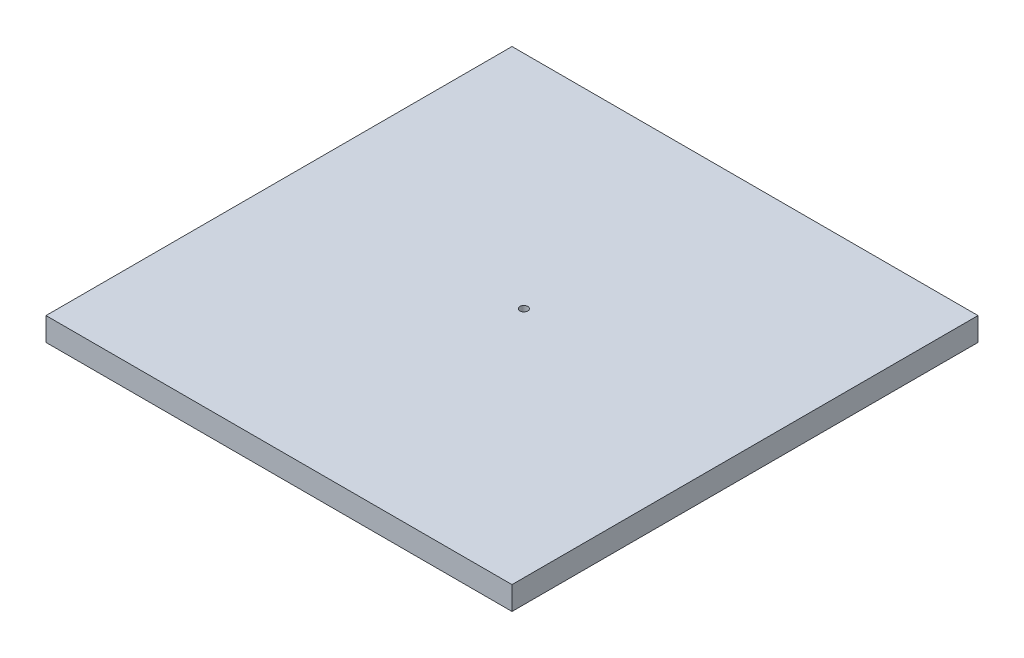
ISO-10303-21;
HEADER;
FILE_DESCRIPTION(('STEP AP214'),'2;1');
FILE_NAME('part.step','',(''),(''),'','','');
FILE_SCHEMA(('AUTOMOTIVE_DESIGN { 1 0 10303 214 1 1 1 1 }'));
ENDSEC;
DATA;
#1=APPLICATION_CONTEXT('core data for automotive mechanical design processes');
#2=APPLICATION_PROTOCOL_DEFINITION('international standard','automotive_design',2000,#1);
#3=PRODUCT_CONTEXT('',#1,'mechanical');
#4=PRODUCT('Part','Part','',(#3));
#5=PRODUCT_RELATED_PRODUCT_CATEGORY('part','',(#4));
#6=PRODUCT_DEFINITION_FORMATION('','',#4);
#7=PRODUCT_DEFINITION_CONTEXT('part definition',#1,'design');
#8=PRODUCT_DEFINITION('design','',#6,#7);
#9=PRODUCT_DEFINITION_SHAPE('','',#8);
#10=(LENGTH_UNIT() NAMED_UNIT(*) SI_UNIT(.MILLI.,.METRE.));
#11=(NAMED_UNIT(*) PLANE_ANGLE_UNIT() SI_UNIT($,.RADIAN.));
#12=(NAMED_UNIT(*) SI_UNIT($,.STERADIAN.) SOLID_ANGLE_UNIT());
#13=UNCERTAINTY_MEASURE_WITH_UNIT(LENGTH_MEASURE(1.E-05),#10,'distance_accuracy_value','');
#14=(GEOMETRIC_REPRESENTATION_CONTEXT(3) GLOBAL_UNCERTAINTY_ASSIGNED_CONTEXT((#13)) GLOBAL_UNIT_ASSIGNED_CONTEXT((#10,
#11,#12)) REPRESENTATION_CONTEXT('',''));
#15=CARTESIAN_POINT('',(0.,0.,0.));
#16=DIRECTION('',(0.,0.,1.));
#17=DIRECTION('',(1.,0.,0.));
#18=AXIS2_PLACEMENT_3D('',#15,#16,#17);
#19=CARTESIAN_POINT('',(-200.,20.,400.));
#20=DIRECTION('',(1.,0.,0.));
#21=DIRECTION('',(0.,0.,-1.));
#22=AXIS2_PLACEMENT_3D('',#19,#20,#21);
#23=PLANE('',#22);
#24=DIRECTION('',(0.,-1.,0.));
#25=VECTOR('',#24,1.);
#26=CARTESIAN_POINT('',(-200.,20.,0.));
#27=LINE('',#26,#25);
#28=CARTESIAN_POINT('',(-200.,20.,0.));
#29=VERTEX_POINT('',#28);
#30=CARTESIAN_POINT('',(-200.,0.,0.));
#31=VERTEX_POINT('',#30);
#32=EDGE_CURVE('E98',#29,#31,#27,.T.);
#33=ORIENTED_EDGE('',*,*,#32,.T.);
#34=DIRECTION('',(0.,0.,-1.));
#35=VECTOR('',#34,1.);
#36=CARTESIAN_POINT('',(-200.,0.,400.));
#37=LINE('',#36,#35);
#38=CARTESIAN_POINT('',(-200.,0.,400.));
#39=VERTEX_POINT('',#38);
#40=EDGE_CURVE('E11',#39,#31,#37,.T.);
#41=ORIENTED_EDGE('',*,*,#40,.F.);
#42=DIRECTION('',(0.,-1.,0.));
#43=VECTOR('',#42,1.);
#44=CARTESIAN_POINT('',(-200.,20.,400.));
#45=LINE('',#44,#43);
#46=CARTESIAN_POINT('',(-200.,20.,400.));
#47=VERTEX_POINT('',#46);
#48=EDGE_CURVE('E84',#47,#39,#45,.T.);
#49=ORIENTED_EDGE('',*,*,#48,.F.);
#50=DIRECTION('',(0.,0.,-1.));
#51=VECTOR('',#50,1.);
#52=CARTESIAN_POINT('',(-200.,20.,400.));
#53=LINE('',#52,#51);
#54=EDGE_CURVE('E51',#47,#29,#53,.T.);
#55=ORIENTED_EDGE('',*,*,#54,.T.);
#56=EDGE_LOOP('',(#33,#41,#49,#55));
#57=FACE_BOUND('',#56,.T.);
#58=ADVANCED_FACE('F35',(#57),#23,.F.);
#59=CARTESIAN_POINT('',(-200.,0.,400.));
#60=DIRECTION('',(0.,1.,0.));
#61=DIRECTION('',(0.,0.,1.));
#62=AXIS2_PLACEMENT_3D('',#59,#60,#61);
#63=PLANE('',#62);
#64=CARTESIAN_POINT('',(0.,0.,189.819719023603));
#65=DIRECTION('',(0.,-1.,0.));
#66=DIRECTION('',(0.,0.,-1.));
#67=AXIS2_PLACEMENT_3D('',#64,#65,#66);
#68=CIRCLE('',#67,3.39999999999999);
#69=CARTESIAN_POINT('',(0.,0.,186.419719023603));
#70=VERTEX_POINT('',#69);
#71=EDGE_CURVE('E112',#70,#70,#68,.T.);
#72=ORIENTED_EDGE('',*,*,#71,.F.);
#73=EDGE_LOOP('',(#72));
#74=FACE_BOUND('',#73,.T.);
#75=DIRECTION('',(1.,0.,0.));
#76=VECTOR('',#75,1.);
#77=CARTESIAN_POINT('',(-200.,0.,0.));
#78=LINE('',#77,#76);
#79=CARTESIAN_POINT('',(200.,0.,0.));
#80=VERTEX_POINT('',#79);
#81=EDGE_CURVE('E89',#31,#80,#78,.T.);
#82=ORIENTED_EDGE('',*,*,#81,.T.);
#83=DIRECTION('',(0.,0.,-1.));
#84=VECTOR('',#83,1.);
#85=CARTESIAN_POINT('',(200.,0.,400.));
#86=LINE('',#85,#84);
#87=CARTESIAN_POINT('',(200.,0.,400.));
#88=VERTEX_POINT('',#87);
#89=EDGE_CURVE('E43',#88,#80,#86,.T.);
#90=ORIENTED_EDGE('',*,*,#89,.F.);
#91=DIRECTION('',(1.,0.,0.));
#92=VECTOR('',#91,1.);
#93=CARTESIAN_POINT('',(-200.,0.,400.));
#94=LINE('',#93,#92);
#95=EDGE_CURVE('E76',#39,#88,#94,.T.);
#96=ORIENTED_EDGE('',*,*,#95,.F.);
#97=ORIENTED_EDGE('',*,*,#40,.T.);
#98=EDGE_LOOP('',(#82,#90,#96,#97));
#99=FACE_BOUND('',#98,.T.);
#100=ADVANCED_FACE('F88',(#74,#99),#63,.F.);
#101=CARTESIAN_POINT('',(200.,20.,400.));
#102=DIRECTION('',(1.,0.,0.));
#103=DIRECTION('',(0.,0.,-1.));
#104=AXIS2_PLACEMENT_3D('',#101,#102,#103);
#105=PLANE('',#104);
#106=DIRECTION('',(0.,-1.,0.));
#107=VECTOR('',#106,1.);
#108=CARTESIAN_POINT('',(200.,20.,0.));
#109=LINE('',#108,#107);
#110=CARTESIAN_POINT('',(200.,20.,0.));
#111=VERTEX_POINT('',#110);
#112=EDGE_CURVE('E102',#111,#80,#109,.T.);
#113=ORIENTED_EDGE('',*,*,#112,.F.);
#114=DIRECTION('',(0.,0.,-1.));
#115=VECTOR('',#114,1.);
#116=CARTESIAN_POINT('',(200.,20.,400.));
#117=LINE('',#116,#115);
#118=CARTESIAN_POINT('',(200.,20.,400.));
#119=VERTEX_POINT('',#118);
#120=EDGE_CURVE('E65',#119,#111,#117,.T.);
#121=ORIENTED_EDGE('',*,*,#120,.F.);
#122=DIRECTION('',(0.,-1.,0.));
#123=VECTOR('',#122,1.);
#124=CARTESIAN_POINT('',(200.,20.,400.));
#125=LINE('',#124,#123);
#126=EDGE_CURVE('E83',#119,#88,#125,.T.);
#127=ORIENTED_EDGE('',*,*,#126,.T.);
#128=ORIENTED_EDGE('',*,*,#89,.T.);
#129=EDGE_LOOP('',(#113,#121,#127,#128));
#130=FACE_BOUND('',#129,.T.);
#131=ADVANCED_FACE('F92',(#130),#105,.T.);
#132=CARTESIAN_POINT('',(-200.,20.,400.));
#133=DIRECTION('',(0.,1.,0.));
#134=DIRECTION('',(0.,0.,1.));
#135=AXIS2_PLACEMENT_3D('',#132,#133,#134);
#136=PLANE('',#135);
#137=CARTESIAN_POINT('',(0.,20.,189.819719023603));
#138=DIRECTION('',(0.,-1.,0.));
#139=DIRECTION('',(0.,0.,-1.));
#140=AXIS2_PLACEMENT_3D('',#137,#138,#139);
#141=CIRCLE('',#140,3.4);
#142=CARTESIAN_POINT('',(0.,20.,186.419719023603));
#143=VERTEX_POINT('',#142);
#144=EDGE_CURVE('E100',#143,#143,#141,.T.);
#145=ORIENTED_EDGE('',*,*,#144,.T.);
#146=EDGE_LOOP('',(#145));
#147=FACE_BOUND('',#146,.T.);
#148=DIRECTION('',(1.,0.,0.));
#149=VECTOR('',#148,1.);
#150=CARTESIAN_POINT('',(-200.,20.,0.));
#151=LINE('',#150,#149);
#152=EDGE_CURVE('E104',#29,#111,#151,.T.);
#153=ORIENTED_EDGE('',*,*,#152,.F.);
#154=ORIENTED_EDGE('',*,*,#54,.F.);
#155=DIRECTION('',(1.,0.,0.));
#156=VECTOR('',#155,1.);
#157=CARTESIAN_POINT('',(-200.,20.,400.));
#158=LINE('',#157,#156);
#159=EDGE_CURVE('E93',#47,#119,#158,.T.);
#160=ORIENTED_EDGE('',*,*,#159,.T.);
#161=ORIENTED_EDGE('',*,*,#120,.T.);
#162=EDGE_LOOP('',(#153,#154,#160,#161));
#163=FACE_BOUND('',#162,.T.);
#164=ADVANCED_FACE('F123',(#147,#163),#136,.T.);
#165=CARTESIAN_POINT('',(0.,0.,400.));
#166=DIRECTION('',(0.,0.,1.));
#167=DIRECTION('',(1.,0.,0.));
#168=AXIS2_PLACEMENT_3D('',#165,#166,#167);
#169=PLANE('',#168);
#170=ORIENTED_EDGE('',*,*,#48,.T.);
#171=ORIENTED_EDGE('',*,*,#95,.T.);
#172=ORIENTED_EDGE('',*,*,#126,.F.);
#173=ORIENTED_EDGE('',*,*,#159,.F.);
#174=EDGE_LOOP('',(#170,#171,#172,#173));
#175=FACE_BOUND('',#174,.T.);
#176=ADVANCED_FACE('F80',(#175),#169,.T.);
#177=CARTESIAN_POINT('',(0.,0.,0.));
#178=DIRECTION('',(0.,0.,1.));
#179=DIRECTION('',(1.,0.,0.));
#180=AXIS2_PLACEMENT_3D('',#177,#178,#179);
#181=PLANE('',#180);
#182=ORIENTED_EDGE('',*,*,#32,.F.);
#183=ORIENTED_EDGE('',*,*,#152,.T.);
#184=ORIENTED_EDGE('',*,*,#112,.T.);
#185=ORIENTED_EDGE('',*,*,#81,.F.);
#186=EDGE_LOOP('',(#182,#183,#184,#185));
#187=FACE_BOUND('',#186,.T.);
#188=ADVANCED_FACE('F129',(#187),#181,.F.);
#189=CARTESIAN_POINT('',(0.,0.,189.819719023603));
#190=DIRECTION('',(0.,-1.,0.));
#191=DIRECTION('',(0.,0.,-1.));
#192=AXIS2_PLACEMENT_3D('',#189,#190,#191);
#193=CYLINDRICAL_SURFACE('',#192,3.39999999999999);
#194=ORIENTED_EDGE('',*,*,#144,.F.);
#195=EDGE_LOOP('',(#194));
#196=FACE_BOUND('',#195,.T.);
#197=ORIENTED_EDGE('',*,*,#71,.T.);
#198=EDGE_LOOP('',(#197));
#199=FACE_BOUND('',#198,.T.);
#200=ADVANCED_FACE('F116',(#196,#199),#193,.F.);
#201=CLOSED_SHELL('',(#58,#100,#131,#164,#176,#188,#200));
#202=MANIFOLD_SOLID_BREP('B2',#201);
#203=ADVANCED_BREP_SHAPE_REPRESENTATION('',(#18,#202),#14);
#204=SHAPE_DEFINITION_REPRESENTATION(#9,#203);
ENDSEC;
END-ISO-10303-21;
